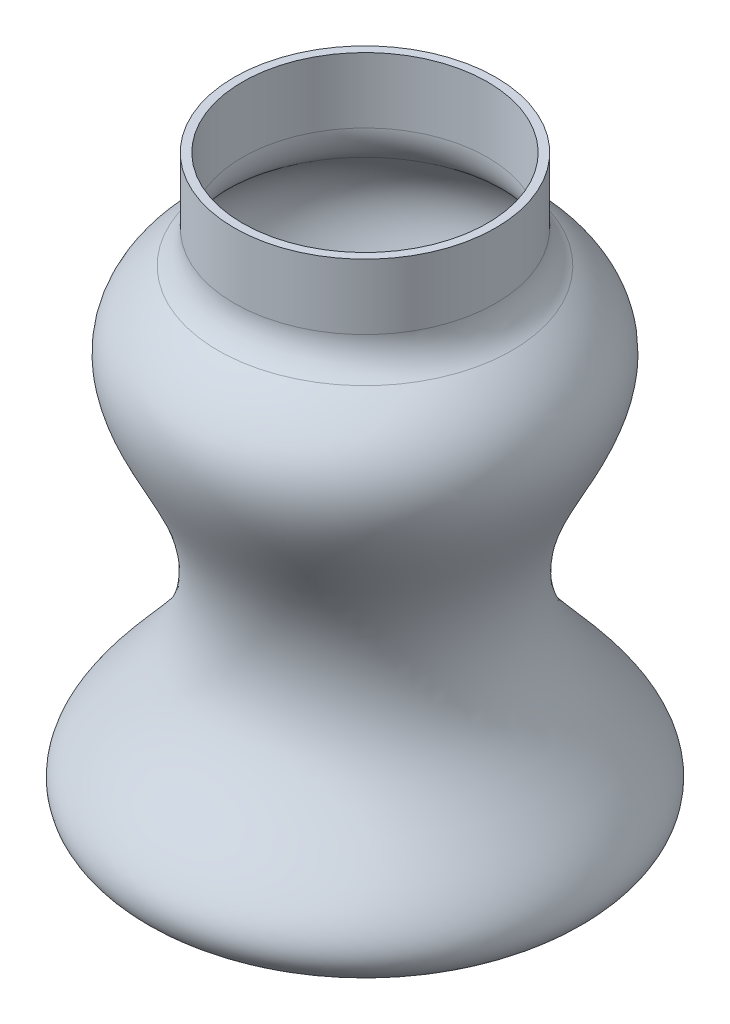
ISO-10303-21;
HEADER;
FILE_DESCRIPTION(('STEP AP214'),'2;1');
FILE_NAME('part.step','',(''),(''),'','','');
FILE_SCHEMA(('AUTOMOTIVE_DESIGN { 1 0 10303 214 1 1 1 1 }'));
ENDSEC;
DATA;
#1=APPLICATION_CONTEXT('core data for automotive mechanical design processes');
#2=APPLICATION_PROTOCOL_DEFINITION('international standard','automotive_design',2000,#1);
#3=PRODUCT_CONTEXT('',#1,'mechanical');
#4=PRODUCT('Part','Part','',(#3));
#5=PRODUCT_RELATED_PRODUCT_CATEGORY('part','',(#4));
#6=PRODUCT_DEFINITION_FORMATION('','',#4);
#7=PRODUCT_DEFINITION_CONTEXT('part definition',#1,'design');
#8=PRODUCT_DEFINITION('design','',#6,#7);
#9=PRODUCT_DEFINITION_SHAPE('','',#8);
#10=(LENGTH_UNIT() NAMED_UNIT(*) SI_UNIT(.MILLI.,.METRE.));
#11=(NAMED_UNIT(*) PLANE_ANGLE_UNIT() SI_UNIT($,.RADIAN.));
#12=(NAMED_UNIT(*) SI_UNIT($,.STERADIAN.) SOLID_ANGLE_UNIT());
#13=UNCERTAINTY_MEASURE_WITH_UNIT(LENGTH_MEASURE(1.E-05),#10,'distance_accuracy_value','');
#14=(GEOMETRIC_REPRESENTATION_CONTEXT(3) GLOBAL_UNCERTAINTY_ASSIGNED_CONTEXT((#13)) GLOBAL_UNIT_ASSIGNED_CONTEXT((#10,
#11,#12)) REPRESENTATION_CONTEXT('',''));
#15=CARTESIAN_POINT('',(0.,0.,0.));
#16=DIRECTION('',(0.,0.,1.));
#17=DIRECTION('',(1.,0.,0.));
#18=AXIS2_PLACEMENT_3D('',#15,#16,#17);
#19=CARTESIAN_POINT('',(0.,71.,0.));
#20=DIRECTION('',(0.,1.,0.));
#21=DIRECTION('',(0.,0.,1.));
#22=AXIS2_PLACEMENT_3D('',#19,#20,#21);
#23=PLANE('',#22);
#24=CARTESIAN_POINT('',(0.,71.,0.));
#25=DIRECTION('',(0.,-1.,0.));
#26=DIRECTION('',(0.,0.,-1.));
#27=AXIS2_PLACEMENT_3D('',#24,#25,#26);
#28=CIRCLE('',#27,15.);
#29=CARTESIAN_POINT('',(0.,71.,-15.));
#30=VERTEX_POINT('',#29);
#31=EDGE_CURVE('E11',#30,#30,#28,.T.);
#32=ORIENTED_EDGE('',*,*,#31,.T.);
#33=EDGE_LOOP('',(#32));
#34=FACE_BOUND('',#33,.T.);
#35=CARTESIAN_POINT('',(0.,71.,0.));
#36=DIRECTION('',(0.,-1.,0.));
#37=DIRECTION('',(0.,0.,-1.));
#38=AXIS2_PLACEMENT_3D('',#35,#36,#37);
#39=CIRCLE('',#38,16.);
#40=CARTESIAN_POINT('',(0.,71.,-16.));
#41=VERTEX_POINT('',#40);
#42=EDGE_CURVE('E80',#41,#41,#39,.T.);
#43=ORIENTED_EDGE('',*,*,#42,.F.);
#44=EDGE_LOOP('',(#43));
#45=FACE_BOUND('',#44,.T.);
#46=ADVANCED_FACE('F45',(#34,#45),#23,.T.);
#47=CARTESIAN_POINT('',(0.,0.,0.));
#48=DIRECTION('',(0.,-1.,0.));
#49=DIRECTION('',(0.,0.,-1.));
#50=AXIS2_PLACEMENT_3D('',#47,#48,#49);
#51=CYLINDRICAL_SURFACE('',#50,15.);
#52=CARTESIAN_POINT('',(0.,62.9999999999999,0.));
#53=DIRECTION('',(0.,-1.,0.));
#54=DIRECTION('',(0.,0.,-1.));
#55=AXIS2_PLACEMENT_3D('',#52,#53,#54);
#56=CIRCLE('',#55,15.);
#57=CARTESIAN_POINT('',(0.,62.9999999999999,-15.));
#58=VERTEX_POINT('',#57);
#59=EDGE_CURVE('E54',#58,#58,#56,.T.);
#60=ORIENTED_EDGE('',*,*,#59,.T.);
#61=EDGE_LOOP('',(#60));
#62=FACE_BOUND('',#61,.T.);
#63=ORIENTED_EDGE('',*,*,#31,.F.);
#64=EDGE_LOOP('',(#63));
#65=FACE_BOUND('',#64,.T.);
#66=ADVANCED_FACE('F106',(#62,#65),#51,.F.);
#67=CARTESIAN_POINT('',(0.,62.9999999999999,0.));
#68=DIRECTION('',(0.,-1.,0.));
#69=DIRECTION('',(0.,0.,-1.));
#70=AXIS2_PLACEMENT_3D('',#67,#68,#69);
#71=TOROIDAL_SURFACE('',#70,20.9999999999997,5.99999999999973);
#72=CARTESIAN_POINT('',(0.,58.2,0.));
#73=DIRECTION('',(0.,-1.,0.));
#74=DIRECTION('',(0.,0.,-1.));
#75=AXIS2_PLACEMENT_3D('',#72,#73,#74);
#76=CIRCLE('',#75,17.4);
#77=CARTESIAN_POINT('',(0.,58.2,-17.4));
#78=VERTEX_POINT('',#77);
#79=EDGE_CURVE('E204',#78,#78,#76,.T.);
#80=ORIENTED_EDGE('',*,*,#79,.T.);
#81=EDGE_LOOP('',(#80));
#82=FACE_BOUND('',#81,.T.);
#83=ORIENTED_EDGE('',*,*,#59,.F.);
#84=EDGE_LOOP('',(#83));
#85=FACE_BOUND('',#84,.T.);
#86=ADVANCED_FACE('F111',(#82,#85),#71,.T.);
#87=CARTESIAN_POINT('',(18.,59.,0.));
#88=CARTESIAN_POINT('',(24.0372629565323,54.4720527826227,0.));
#89=CARTESIAN_POINT('',(24.5785761570103,46.0870283853835,0.));
#90=CARTESIAN_POINT('',(16.0321449407293,33.8762662622103,0.));
#91=CARTESIAN_POINT('',(14.7459134926478,15.3083930239531,0.));
#92=CARTESIAN_POINT('',(34.4148260415366,4.46695311175705,0.));
#93=CARTESIAN_POINT('',(22.5,0.,0.));
#94=B_SPLINE_CURVE_WITH_KNOTS('',3,(#87,#88,#89,#90,#91,#92,#93),.UNSPECIFIED.,.F.,.F.,(4,1,1,1,
4),(0.,0.205664951186368,0.40058019937629,0.622191458708644,0.978911641646703),.UNSPECIFIED.);
#95=CARTESIAN_POINT('',(0.,0.,0.));
#96=DIRECTION('',(0.,-1.,0.));
#97=AXIS1_PLACEMENT('',#95,#96);
#98=SURFACE_OF_REVOLUTION('',#94,#97);
#99=OFFSET_SURFACE('',#98,-1.,.F.);
#100=CARTESIAN_POINT('',(0.,1.,0.));
#101=DIRECTION('',(0.,-1.,0.));
#102=DIRECTION('',(0.,0.,-1.));
#103=AXIS2_PLACEMENT_3D('',#100,#101,#102);
#104=CIRCLE('',#103,22.3166008941936);
#105=CARTESIAN_POINT('',(0.,1.,-22.3166008941936));
#106=VERTEX_POINT('',#105);
#107=EDGE_CURVE('E86',#106,#106,#104,.T.);
#108=ORIENTED_EDGE('',*,*,#107,.T.);
#109=EDGE_LOOP('',(#108));
#110=FACE_BOUND('',#109,.T.);
#111=ORIENTED_EDGE('',*,*,#79,.F.);
#112=EDGE_LOOP('',(#111));
#113=FACE_BOUND('',#112,.T.);
#114=ADVANCED_FACE('F120',(#110,#113),#99,.F.);
#115=CARTESIAN_POINT('',(22.5,1.,0.));
#116=DIRECTION('',(0.,1.,0.));
#117=DIRECTION('',(0.,0.,1.));
#118=AXIS2_PLACEMENT_3D('',#115,#116,#117);
#119=PLANE('',#118);
#120=CARTESIAN_POINT('',(0.,1.,0.));
#121=DIRECTION('',(0.,1.,0.));
#122=DIRECTION('',(0.,0.,1.));
#123=AXIS2_PLACEMENT_3D('',#120,#121,#122);
#124=CIRCLE('',#123,20.2150398586851);
#125=CARTESIAN_POINT('',(0.,1.,20.2150398586851));
#126=VERTEX_POINT('',#125);
#127=EDGE_CURVE('E82',#126,#126,#124,.F.);
#128=ORIENTED_EDGE('',*,*,#127,.T.);
#129=EDGE_LOOP('',(#128));
#130=FACE_BOUND('',#129,.T.);
#131=ORIENTED_EDGE('',*,*,#107,.F.);
#132=EDGE_LOOP('',(#131));
#133=FACE_BOUND('',#132,.T.);
#134=ADVANCED_FACE('F103',(#130,#133),#119,.T.);
#135=CARTESIAN_POINT('',(0.,-40.9780802807127,-1.40438394385746));
#136=DIRECTION('',(-1.,0.,0.));
#137=DIRECTION('',(0.,0.,-1.));
#138=AXIS2_PLACEMENT_3D('',#135,#136,#137);
#139=CIRCLE('',#138,46.);
#140=TRIMMED_CURVE('',#139,(PARAMETER_VALUE(-1.60133115729961)),
(PARAMETER_VALUE(1.60133115729961)),.T.,.PARAMETER.);
#141=CARTESIAN_POINT('',(0.,-40.9780802807127,0.));
#142=DIRECTION('',(0.,-1.,0.));
#143=AXIS1_PLACEMENT('',#141,#142);
#144=SURFACE_OF_REVOLUTION('',#140,#143);
#145=CARTESIAN_POINT('',(0.,5.00047674034046,0.));
#146=VERTEX_POINT('',#145);
#147=VERTEX_LOOP('',#146);
#148=FACE_BOUND('',#147,.T.);
#149=ORIENTED_EDGE('',*,*,#127,.F.);
#150=EDGE_LOOP('',(#149));
#151=FACE_BOUND('',#150,.T.);
#152=ADVANCED_FACE('F95',(#148,#151),#144,.T.);
#153=CARTESIAN_POINT('',(0.,0.,0.));
#154=DIRECTION('',(0.,-1.,0.));
#155=DIRECTION('',(0.,0.,-1.));
#156=AXIS2_PLACEMENT_3D('',#153,#154,#155);
#157=CYLINDRICAL_SURFACE('',#156,16.);
#158=CARTESIAN_POINT('',(0.,62.9999999999999,0.));
#159=DIRECTION('',(0.,-1.,0.));
#160=DIRECTION('',(0.,0.,-1.));
#161=AXIS2_PLACEMENT_3D('',#158,#159,#160);
#162=CIRCLE('',#161,16.);
#163=CARTESIAN_POINT('',(0.,62.9999999999999,-16.));
#164=VERTEX_POINT('',#163);
#165=EDGE_CURVE('E48',#164,#164,#162,.T.);
#166=ORIENTED_EDGE('',*,*,#165,.F.);
#167=EDGE_LOOP('',(#166));
#168=FACE_BOUND('',#167,.T.);
#169=ORIENTED_EDGE('',*,*,#42,.T.);
#170=EDGE_LOOP('',(#169));
#171=FACE_BOUND('',#170,.T.);
#172=ADVANCED_FACE('F93',(#168,#171),#157,.T.);
#173=CARTESIAN_POINT('',(0.,62.9999999999999,0.));
#174=DIRECTION('',(0.,-1.,0.));
#175=DIRECTION('',(0.,0.,-1.));
#176=AXIS2_PLACEMENT_3D('',#173,#174,#175);
#177=TOROIDAL_SURFACE('',#176,20.9999999999997,4.99999999999973);
#178=CARTESIAN_POINT('',(0.,59.,0.));
#179=DIRECTION('',(0.,-1.,0.));
#180=DIRECTION('',(0.,0.,-1.));
#181=AXIS2_PLACEMENT_3D('',#178,#179,#180);
#182=CIRCLE('',#181,18.);
#183=CARTESIAN_POINT('',(0.,59.,-18.));
#184=VERTEX_POINT('',#183);
#185=EDGE_CURVE('E72',#184,#184,#182,.T.);
#186=ORIENTED_EDGE('',*,*,#185,.F.);
#187=EDGE_LOOP('',(#186));
#188=FACE_BOUND('',#187,.T.);
#189=ORIENTED_EDGE('',*,*,#165,.T.);
#190=EDGE_LOOP('',(#189));
#191=FACE_BOUND('',#190,.T.);
#192=ADVANCED_FACE('F91',(#188,#191),#177,.F.);
#193=CARTESIAN_POINT('',(18.,59.,0.));
#194=CARTESIAN_POINT('',(24.0372629565323,54.4720527826227,0.));
#195=CARTESIAN_POINT('',(24.5785761570103,46.0870283853835,0.));
#196=CARTESIAN_POINT('',(16.0321449407293,33.8762662622103,0.));
#197=CARTESIAN_POINT('',(14.7459134926478,15.3083930239531,0.));
#198=CARTESIAN_POINT('',(34.4148260415366,4.46695311175705,0.));
#199=CARTESIAN_POINT('',(22.5,0.,0.));
#200=B_SPLINE_CURVE_WITH_KNOTS('',3,(#193,#194,#195,#196,#197,#198,#199),.UNSPECIFIED.,.F.,.F.,
(4,1,1,1,4),(0.,0.205664951186368,0.40058019937629,0.622191458708644,0.978911641646703),.UNSPECIFIED.);
#201=CARTESIAN_POINT('',(0.,0.,0.));
#202=DIRECTION('',(0.,-1.,0.));
#203=AXIS1_PLACEMENT('',#201,#202);
#204=SURFACE_OF_REVOLUTION('',#200,#203);
#205=CARTESIAN_POINT('',(0.,0.,0.));
#206=DIRECTION('',(0.,-1.,0.));
#207=DIRECTION('',(0.,0.,-1.));
#208=AXIS2_PLACEMENT_3D('',#205,#206,#207);
#209=CIRCLE('',#208,22.5);
#210=CARTESIAN_POINT('',(0.,0.,-22.5));
#211=VERTEX_POINT('',#210);
#212=EDGE_CURVE('E69',#211,#211,#209,.T.);
#213=ORIENTED_EDGE('',*,*,#212,.F.);
#214=EDGE_LOOP('',(#213));
#215=FACE_BOUND('',#214,.T.);
#216=ORIENTED_EDGE('',*,*,#185,.T.);
#217=EDGE_LOOP('',(#216));
#218=FACE_BOUND('',#217,.T.);
#219=ADVANCED_FACE('F100',(#215,#218),#204,.T.);
#220=CARTESIAN_POINT('',(22.5,0.,0.));
#221=DIRECTION('',(0.,1.,0.));
#222=DIRECTION('',(0.,0.,1.));
#223=AXIS2_PLACEMENT_3D('',#220,#221,#222);
#224=PLANE('',#223);
#225=CARTESIAN_POINT('',(0.,0.,0.));
#226=DIRECTION('',(0.,-1.,0.));
#227=DIRECTION('',(0.,0.,-1.));
#228=AXIS2_PLACEMENT_3D('',#225,#226,#227);
#229=CIRCLE('',#228,20.);
#230=CARTESIAN_POINT('',(0.,0.,-20.));
#231=VERTEX_POINT('',#230);
#232=EDGE_CURVE('E67',#231,#231,#229,.T.);
#233=ORIENTED_EDGE('',*,*,#232,.F.);
#234=EDGE_LOOP('',(#233));
#235=FACE_BOUND('',#234,.T.);
#236=ORIENTED_EDGE('',*,*,#212,.T.);
#237=EDGE_LOOP('',(#236));
#238=FACE_BOUND('',#237,.T.);
#239=ADVANCED_FACE('F63',(#235,#238),#224,.F.);
#240=CARTESIAN_POINT('',(0.,-40.9780802807127,-1.40438394385746));
#241=DIRECTION('',(-1.,0.,0.));
#242=DIRECTION('',(0.,0.,-1.));
#243=AXIS2_PLACEMENT_3D('',#240,#241,#242);
#244=CIRCLE('',#243,45.);
#245=TRIMMED_CURVE('',#244,(PARAMETER_VALUE(-1.60200992714416)),
(PARAMETER_VALUE(1.60200992714416)),.T.,.PARAMETER.);
#246=CARTESIAN_POINT('',(0.,-40.9780802807127,0.));
#247=DIRECTION('',(0.,-1.,0.));
#248=AXIS1_PLACEMENT('',#246,#247);
#249=SURFACE_OF_REVOLUTION('',#245,#248);
#250=CARTESIAN_POINT('',(0.,4.,0.));
#251=VERTEX_POINT('',#250);
#252=VERTEX_LOOP('',#251);
#253=FACE_BOUND('',#252,.T.);
#254=ORIENTED_EDGE('',*,*,#232,.T.);
#255=EDGE_LOOP('',(#254));
#256=FACE_BOUND('',#255,.T.);
#257=ADVANCED_FACE('F60',(#253,#256),#249,.F.);
#258=CLOSED_SHELL('',(#46,#66,#86,#114,#134,#152,#172,#192,#219,#239,#257));
#259=MANIFOLD_SOLID_BREP('B2',#258);
#260=ADVANCED_BREP_SHAPE_REPRESENTATION('',(#18,#259),#14);
#261=SHAPE_DEFINITION_REPRESENTATION(#9,#260);
ENDSEC;
END-ISO-10303-21;
